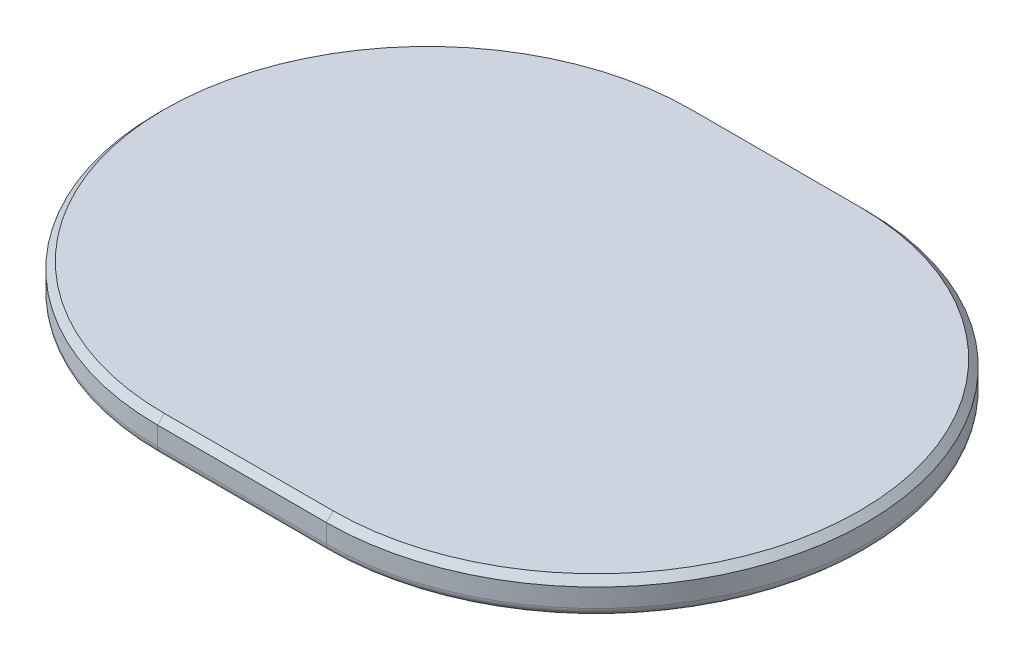
ISO-10303-21;
HEADER;
FILE_DESCRIPTION(('STEP AP214'),'2;1');
FILE_NAME('part.step','',(''),(''),'','','');
FILE_SCHEMA(('AUTOMOTIVE_DESIGN { 1 0 10303 214 1 1 1 1 }'));
ENDSEC;
DATA;
#1=APPLICATION_CONTEXT('core data for automotive mechanical design processes');
#2=APPLICATION_PROTOCOL_DEFINITION('international standard','automotive_design',2000,#1);
#3=PRODUCT_CONTEXT('',#1,'mechanical');
#4=PRODUCT('Part','Part','',(#3));
#5=PRODUCT_RELATED_PRODUCT_CATEGORY('part','',(#4));
#6=PRODUCT_DEFINITION_FORMATION('','',#4);
#7=PRODUCT_DEFINITION_CONTEXT('part definition',#1,'design');
#8=PRODUCT_DEFINITION('design','',#6,#7);
#9=PRODUCT_DEFINITION_SHAPE('','',#8);
#10=(LENGTH_UNIT() NAMED_UNIT(*) SI_UNIT(.MILLI.,.METRE.));
#11=(NAMED_UNIT(*) PLANE_ANGLE_UNIT() SI_UNIT($,.RADIAN.));
#12=(NAMED_UNIT(*) SI_UNIT($,.STERADIAN.) SOLID_ANGLE_UNIT());
#13=UNCERTAINTY_MEASURE_WITH_UNIT(LENGTH_MEASURE(1.E-05),#10,'distance_accuracy_value','');
#14=(GEOMETRIC_REPRESENTATION_CONTEXT(3) GLOBAL_UNCERTAINTY_ASSIGNED_CONTEXT((#13)) GLOBAL_UNIT_ASSIGNED_CONTEXT((#10,
#11,#12)) REPRESENTATION_CONTEXT('',''));
#15=CARTESIAN_POINT('',(0.,0.,0.));
#16=DIRECTION('',(0.,0.,1.));
#17=DIRECTION('',(1.,0.,0.));
#18=AXIS2_PLACEMENT_3D('',#15,#16,#17);
#19=CARTESIAN_POINT('',(-10.,4.,0.));
#20=DIRECTION('',(0.,-1.,0.));
#21=DIRECTION('',(0.,0.,-1.));
#22=AXIS2_PLACEMENT_3D('',#19,#20,#21);
#23=CYLINDRICAL_SURFACE('',#22,32.);
#24=DIRECTION('',(0.,-1.,0.));
#25=VECTOR('',#24,1.);
#26=CARTESIAN_POINT('',(-10.,4.,-32.));
#27=LINE('',#26,#25);
#28=CARTESIAN_POINT('',(-10.,3.20000000000002,-32.));
#29=VERTEX_POINT('',#28);
#30=CARTESIAN_POINT('',(-10.,1.,-32.));
#31=VERTEX_POINT('',#30);
#32=EDGE_CURVE('E155',#29,#31,#27,.T.);
#33=ORIENTED_EDGE('',*,*,#32,.T.);
#34=CARTESIAN_POINT('',(-10.,1.,0.));
#35=DIRECTION('',(0.,1.,0.));
#36=DIRECTION('',(0.,0.,1.));
#37=AXIS2_PLACEMENT_3D('',#34,#35,#36);
#38=CIRCLE('',#37,32.);
#39=CARTESIAN_POINT('',(-10.,1.,32.));
#40=VERTEX_POINT('',#39);
#41=EDGE_CURVE('E11',#31,#40,#38,.T.);
#42=ORIENTED_EDGE('',*,*,#41,.T.);
#43=DIRECTION('',(0.,-1.,0.));
#44=VECTOR('',#43,1.);
#45=CARTESIAN_POINT('',(-10.,4.,32.));
#46=LINE('',#45,#44);
#47=CARTESIAN_POINT('',(-10.,3.20000000000002,32.));
#48=VERTEX_POINT('',#47);
#49=EDGE_CURVE('E129',#48,#40,#46,.T.);
#50=ORIENTED_EDGE('',*,*,#49,.F.);
#51=CARTESIAN_POINT('',(-10.,3.20000000000002,0.));
#52=DIRECTION('',(0.,1.,0.));
#53=DIRECTION('',(0.,0.,1.));
#54=AXIS2_PLACEMENT_3D('',#51,#52,#53);
#55=CIRCLE('',#54,32.);
#56=EDGE_CURVE('E145',#48,#29,#55,.F.);
#57=ORIENTED_EDGE('',*,*,#56,.T.);
#58=EDGE_LOOP('',(#33,#42,#50,#57));
#59=FACE_BOUND('',#58,.T.);
#60=ADVANCED_FACE('F41',(#59),#23,.T.);
#61=CARTESIAN_POINT('',(-10.,4.,32.));
#62=DIRECTION('',(0.,0.,-1.));
#63=DIRECTION('',(-1.,0.,0.));
#64=AXIS2_PLACEMENT_3D('',#61,#62,#63);
#65=PLANE('',#64);
#66=ORIENTED_EDGE('',*,*,#49,.T.);
#67=DIRECTION('',(1.,0.,0.));
#68=VECTOR('',#67,1.);
#69=CARTESIAN_POINT('',(-10.,1.,32.));
#70=LINE('',#69,#68);
#71=CARTESIAN_POINT('',(10.,1.,32.));
#72=VERTEX_POINT('',#71);
#73=EDGE_CURVE('E144',#40,#72,#70,.T.);
#74=ORIENTED_EDGE('',*,*,#73,.T.);
#75=DIRECTION('',(0.,-1.,0.));
#76=VECTOR('',#75,1.);
#77=CARTESIAN_POINT('',(10.,4.,32.));
#78=LINE('',#77,#76);
#79=CARTESIAN_POINT('',(10.,3.20000000000002,32.));
#80=VERTEX_POINT('',#79);
#81=EDGE_CURVE('E192',#80,#72,#78,.T.);
#82=ORIENTED_EDGE('',*,*,#81,.F.);
#83=DIRECTION('',(-1.,0.,0.));
#84=VECTOR('',#83,1.);
#85=CARTESIAN_POINT('',(-10.,3.20000000000002,32.));
#86=LINE('',#85,#84);
#87=EDGE_CURVE('E142',#80,#48,#86,.T.);
#88=ORIENTED_EDGE('',*,*,#87,.T.);
#89=EDGE_LOOP('',(#66,#74,#82,#88));
#90=FACE_BOUND('',#89,.T.);
#91=ADVANCED_FACE('F193',(#90),#65,.F.);
#92=CARTESIAN_POINT('',(10.,4.,0.));
#93=DIRECTION('',(0.,-1.,0.));
#94=DIRECTION('',(0.,0.,-1.));
#95=AXIS2_PLACEMENT_3D('',#92,#93,#94);
#96=CYLINDRICAL_SURFACE('',#95,32.);
#97=ORIENTED_EDGE('',*,*,#81,.T.);
#98=CARTESIAN_POINT('',(10.,1.,0.));
#99=DIRECTION('',(0.,1.,0.));
#100=DIRECTION('',(0.,0.,1.));
#101=AXIS2_PLACEMENT_3D('',#98,#99,#100);
#102=CIRCLE('',#101,32.);
#103=CARTESIAN_POINT('',(9.99999999999999,1.,-32.));
#104=VERTEX_POINT('',#103);
#105=EDGE_CURVE('E65',#72,#104,#102,.T.);
#106=ORIENTED_EDGE('',*,*,#105,.T.);
#107=DIRECTION('',(0.,-1.,0.));
#108=VECTOR('',#107,1.);
#109=CARTESIAN_POINT('',(9.99999999999999,4.,-32.));
#110=LINE('',#109,#108);
#111=CARTESIAN_POINT('',(9.99999999999999,3.20000000000002,-32.));
#112=VERTEX_POINT('',#111);
#113=EDGE_CURVE('E199',#112,#104,#110,.T.);
#114=ORIENTED_EDGE('',*,*,#113,.F.);
#115=CARTESIAN_POINT('',(10.,3.20000000000002,0.));
#116=DIRECTION('',(0.,1.,0.));
#117=DIRECTION('',(0.,0.,1.));
#118=AXIS2_PLACEMENT_3D('',#115,#116,#117);
#119=CIRCLE('',#118,32.);
#120=EDGE_CURVE('E139',#112,#80,#119,.F.);
#121=ORIENTED_EDGE('',*,*,#120,.T.);
#122=EDGE_LOOP('',(#97,#106,#114,#121));
#123=FACE_BOUND('',#122,.T.);
#124=ADVANCED_FACE('F196',(#123),#96,.T.);
#125=CARTESIAN_POINT('',(-10.,4.,-32.));
#126=DIRECTION('',(0.,0.,1.));
#127=DIRECTION('',(1.,0.,0.));
#128=AXIS2_PLACEMENT_3D('',#125,#126,#127);
#129=PLANE('',#128);
#130=ORIENTED_EDGE('',*,*,#113,.T.);
#131=DIRECTION('',(-1.,0.,0.));
#132=VECTOR('',#131,1.);
#133=CARTESIAN_POINT('',(-10.,1.,-32.));
#134=LINE('',#133,#132);
#135=EDGE_CURVE('E49',#104,#31,#134,.T.);
#136=ORIENTED_EDGE('',*,*,#135,.T.);
#137=ORIENTED_EDGE('',*,*,#32,.F.);
#138=DIRECTION('',(1.,0.,0.));
#139=VECTOR('',#138,1.);
#140=CARTESIAN_POINT('',(9.99999999999999,3.20000000000002,-32.));
#141=LINE('',#140,#139);
#142=EDGE_CURVE('E116',#29,#112,#141,.T.);
#143=ORIENTED_EDGE('',*,*,#142,.T.);
#144=EDGE_LOOP('',(#130,#136,#137,#143));
#145=FACE_BOUND('',#144,.T.);
#146=ADVANCED_FACE('F209',(#145),#129,.F.);
#147=CARTESIAN_POINT('',(-10.,4.,0.));
#148=DIRECTION('',(0.,1.,0.));
#149=DIRECTION('',(0.,0.,1.));
#150=AXIS2_PLACEMENT_3D('',#147,#148,#149);
#151=PLANE('',#150);
#152=CARTESIAN_POINT('',(10.,4.,0.));
#153=DIRECTION('',(0.,1.,0.));
#154=DIRECTION('',(0.,0.,1.));
#155=AXIS2_PLACEMENT_3D('',#152,#153,#154);
#156=CIRCLE('',#155,31.2);
#157=CARTESIAN_POINT('',(10.,4.,31.2));
#158=VERTEX_POINT('',#157);
#159=CARTESIAN_POINT('',(9.99999999999999,4.,-31.2));
#160=VERTEX_POINT('',#159);
#161=EDGE_CURVE('E134',#158,#160,#156,.T.);
#162=ORIENTED_EDGE('',*,*,#161,.T.);
#163=DIRECTION('',(-1.,0.,0.));
#164=VECTOR('',#163,1.);
#165=CARTESIAN_POINT('',(-10.,4.,-31.2));
#166=LINE('',#165,#164);
#167=CARTESIAN_POINT('',(-10.,4.,-31.2));
#168=VERTEX_POINT('',#167);
#169=EDGE_CURVE('E111',#160,#168,#166,.T.);
#170=ORIENTED_EDGE('',*,*,#169,.T.);
#171=CARTESIAN_POINT('',(-10.,4.,0.));
#172=DIRECTION('',(0.,1.,0.));
#173=DIRECTION('',(0.,0.,1.));
#174=AXIS2_PLACEMENT_3D('',#171,#172,#173);
#175=CIRCLE('',#174,31.2);
#176=CARTESIAN_POINT('',(-10.,4.,31.2));
#177=VERTEX_POINT('',#176);
#178=EDGE_CURVE('E121',#168,#177,#175,.T.);
#179=ORIENTED_EDGE('',*,*,#178,.T.);
#180=DIRECTION('',(1.,0.,0.));
#181=VECTOR('',#180,1.);
#182=CARTESIAN_POINT('',(10.,4.,31.2));
#183=LINE('',#182,#181);
#184=EDGE_CURVE('E126',#177,#158,#183,.T.);
#185=ORIENTED_EDGE('',*,*,#184,.T.);
#186=EDGE_LOOP('',(#162,#170,#179,#185));
#187=FACE_BOUND('',#186,.T.);
#188=ADVANCED_FACE('F131',(#187),#151,.T.);
#189=CARTESIAN_POINT('',(-10.,0.,0.));
#190=DIRECTION('',(0.,1.,0.));
#191=DIRECTION('',(0.,0.,1.));
#192=AXIS2_PLACEMENT_3D('',#189,#190,#191);
#193=PLANE('',#192);
#194=CARTESIAN_POINT('',(10.,0.,0.));
#195=DIRECTION('',(0.,1.,0.));
#196=DIRECTION('',(0.,0.,1.));
#197=AXIS2_PLACEMENT_3D('',#194,#195,#196);
#198=CIRCLE('',#197,31.);
#199=CARTESIAN_POINT('',(9.99999999999999,0.,-31.));
#200=VERTEX_POINT('',#199);
#201=CARTESIAN_POINT('',(10.,0.,31.));
#202=VERTEX_POINT('',#201);
#203=EDGE_CURVE('E157',#200,#202,#198,.F.);
#204=ORIENTED_EDGE('',*,*,#203,.T.);
#205=DIRECTION('',(1.,0.,0.));
#206=VECTOR('',#205,1.);
#207=CARTESIAN_POINT('',(-9.99999999999999,0.,31.));
#208=LINE('',#207,#206);
#209=CARTESIAN_POINT('',(-10.,0.,31.));
#210=VERTEX_POINT('',#209);
#211=EDGE_CURVE('E161',#202,#210,#208,.F.);
#212=ORIENTED_EDGE('',*,*,#211,.T.);
#213=CARTESIAN_POINT('',(-10.,0.,0.));
#214=DIRECTION('',(0.,1.,0.));
#215=DIRECTION('',(0.,0.,1.));
#216=AXIS2_PLACEMENT_3D('',#213,#214,#215);
#217=CIRCLE('',#216,31.);
#218=CARTESIAN_POINT('',(-10.,0.,-31.));
#219=VERTEX_POINT('',#218);
#220=EDGE_CURVE('E154',#210,#219,#217,.F.);
#221=ORIENTED_EDGE('',*,*,#220,.T.);
#222=DIRECTION('',(-1.,0.,0.));
#223=VECTOR('',#222,1.);
#224=CARTESIAN_POINT('',(-10.,0.,-31.));
#225=LINE('',#224,#223);
#226=EDGE_CURVE('E160',#219,#200,#225,.F.);
#227=ORIENTED_EDGE('',*,*,#226,.T.);
#228=EDGE_LOOP('',(#204,#212,#221,#227));
#229=FACE_BOUND('',#228,.T.);
#230=ADVANCED_FACE('F184',(#229),#193,.F.);
#231=CARTESIAN_POINT('',(-9.99999999999999,4.,31.2));
#232=DIRECTION('',(0.,0.707106781186554,0.707106781186541));
#233=DIRECTION('',(-1.,0.,0.));
#234=AXIS2_PLACEMENT_3D('',#231,#232,#233);
#235=PLANE('',#234);
#236=DIRECTION('',(0.,0.707106781186541,-0.707106781186554));
#237=VECTOR('',#236,1.);
#238=CARTESIAN_POINT('',(-10.,3.20000000000002,32.));
#239=LINE('',#238,#237);
#240=EDGE_CURVE('E122',#48,#177,#239,.T.);
#241=ORIENTED_EDGE('',*,*,#240,.F.);
#242=ORIENTED_EDGE('',*,*,#87,.F.);
#243=DIRECTION('',(0.,-0.707106781186541,0.707106781186554));
#244=VECTOR('',#243,1.);
#245=CARTESIAN_POINT('',(10.,4.,31.2));
#246=LINE('',#245,#244);
#247=EDGE_CURVE('E149',#158,#80,#246,.T.);
#248=ORIENTED_EDGE('',*,*,#247,.F.);
#249=ORIENTED_EDGE('',*,*,#184,.F.);
#250=EDGE_LOOP('',(#241,#242,#248,#249));
#251=FACE_BOUND('',#250,.T.);
#252=ADVANCED_FACE('F210',(#251),#235,.T.);
#253=CARTESIAN_POINT('',(10.,4.,0.));
#254=DIRECTION('',(0.,-1.,0.));
#255=DIRECTION('',(0.,0.,-1.));
#256=AXIS2_PLACEMENT_3D('',#253,#254,#255);
#257=CONICAL_SURFACE('',#256,31.2,0.785398163397457);
#258=ORIENTED_EDGE('',*,*,#247,.T.);
#259=ORIENTED_EDGE('',*,*,#120,.F.);
#260=DIRECTION('',(0.,-0.70710678118654,-0.707106781186555));
#261=VECTOR('',#260,1.);
#262=CARTESIAN_POINT('',(9.99999999999999,4.,-31.2));
#263=LINE('',#262,#261);
#264=EDGE_CURVE('E118',#160,#112,#263,.T.);
#265=ORIENTED_EDGE('',*,*,#264,.F.);
#266=ORIENTED_EDGE('',*,*,#161,.F.);
#267=EDGE_LOOP('',(#258,#259,#265,#266));
#268=FACE_BOUND('',#267,.T.);
#269=ADVANCED_FACE('F207',(#268),#257,.T.);
#270=CARTESIAN_POINT('',(-10.,4.,0.));
#271=DIRECTION('',(0.,-1.,0.));
#272=DIRECTION('',(0.,0.,-1.));
#273=AXIS2_PLACEMENT_3D('',#270,#271,#272);
#274=CONICAL_SURFACE('',#273,31.2,0.785398163397457);
#275=ORIENTED_EDGE('',*,*,#240,.T.);
#276=ORIENTED_EDGE('',*,*,#178,.F.);
#277=DIRECTION('',(0.,0.707106781186541,0.707106781186554));
#278=VECTOR('',#277,1.);
#279=CARTESIAN_POINT('',(-10.,3.20000000000002,-32.));
#280=LINE('',#279,#278);
#281=EDGE_CURVE('E109',#29,#168,#280,.T.);
#282=ORIENTED_EDGE('',*,*,#281,.F.);
#283=ORIENTED_EDGE('',*,*,#56,.F.);
#284=EDGE_LOOP('',(#275,#276,#282,#283));
#285=FACE_BOUND('',#284,.T.);
#286=ADVANCED_FACE('F125',(#285),#274,.T.);
#287=CARTESIAN_POINT('',(-10.,4.,-31.2));
#288=DIRECTION('',(0.,0.707106781186554,-0.707106781186541));
#289=DIRECTION('',(1.,0.,0.));
#290=AXIS2_PLACEMENT_3D('',#287,#288,#289);
#291=PLANE('',#290);
#292=ORIENTED_EDGE('',*,*,#264,.T.);
#293=ORIENTED_EDGE('',*,*,#142,.F.);
#294=ORIENTED_EDGE('',*,*,#281,.T.);
#295=ORIENTED_EDGE('',*,*,#169,.F.);
#296=EDGE_LOOP('',(#292,#293,#294,#295));
#297=FACE_BOUND('',#296,.T.);
#298=ADVANCED_FACE('F115',(#297),#291,.T.);
#299=CARTESIAN_POINT('',(-10.,1.,-31.));
#300=DIRECTION('',(-1.,0.,0.));
#301=DIRECTION('',(0.,0.,1.));
#302=AXIS2_PLACEMENT_3D('',#299,#300,#301);
#303=CYLINDRICAL_SURFACE('',#302,1.);
#304=CARTESIAN_POINT('',(9.99999999999999,1.,-31.));
#305=DIRECTION('',(1.,0.,0.));
#306=DIRECTION('',(0.,0.,-1.));
#307=AXIS2_PLACEMENT_3D('',#304,#305,#306);
#308=CIRCLE('',#307,1.);
#309=EDGE_CURVE('E166',#200,#104,#308,.T.);
#310=ORIENTED_EDGE('',*,*,#309,.F.);
#311=ORIENTED_EDGE('',*,*,#226,.F.);
#312=CARTESIAN_POINT('',(-10.,1.,-31.));
#313=DIRECTION('',(-1.,0.,0.));
#314=DIRECTION('',(0.,0.,1.));
#315=AXIS2_PLACEMENT_3D('',#312,#313,#314);
#316=CIRCLE('',#315,1.);
#317=EDGE_CURVE('E44',#31,#219,#316,.T.);
#318=ORIENTED_EDGE('',*,*,#317,.F.);
#319=ORIENTED_EDGE('',*,*,#135,.F.);
#320=EDGE_LOOP('',(#310,#311,#318,#319));
#321=FACE_BOUND('',#320,.T.);
#322=ADVANCED_FACE('F43',(#321),#303,.T.);
#323=CARTESIAN_POINT('',(-10.,1.,0.));
#324=DIRECTION('',(0.,1.,0.));
#325=DIRECTION('',(0.,0.,1.));
#326=AXIS2_PLACEMENT_3D('',#323,#324,#325);
#327=TOROIDAL_SURFACE('',#326,31.,1.);
#328=ORIENTED_EDGE('',*,*,#317,.T.);
#329=ORIENTED_EDGE('',*,*,#220,.F.);
#330=CARTESIAN_POINT('',(-10.,1.,31.));
#331=DIRECTION('',(1.,0.,0.));
#332=DIRECTION('',(0.,0.,-1.));
#333=AXIS2_PLACEMENT_3D('',#330,#331,#332);
#334=CIRCLE('',#333,1.);
#335=EDGE_CURVE('E169',#40,#210,#334,.T.);
#336=ORIENTED_EDGE('',*,*,#335,.F.);
#337=ORIENTED_EDGE('',*,*,#41,.F.);
#338=EDGE_LOOP('',(#328,#329,#336,#337));
#339=FACE_BOUND('',#338,.T.);
#340=ADVANCED_FACE('F178',(#339),#327,.T.);
#341=CARTESIAN_POINT('',(10.,1.,0.));
#342=DIRECTION('',(0.,1.,0.));
#343=DIRECTION('',(0.,0.,1.));
#344=AXIS2_PLACEMENT_3D('',#341,#342,#343);
#345=TOROIDAL_SURFACE('',#344,31.,1.);
#346=ORIENTED_EDGE('',*,*,#309,.T.);
#347=ORIENTED_EDGE('',*,*,#105,.F.);
#348=CARTESIAN_POINT('',(10.,1.,31.));
#349=DIRECTION('',(-1.,0.,0.));
#350=DIRECTION('',(0.,0.,1.));
#351=AXIS2_PLACEMENT_3D('',#348,#349,#350);
#352=CIRCLE('',#351,1.);
#353=EDGE_CURVE('E167',#202,#72,#352,.T.);
#354=ORIENTED_EDGE('',*,*,#353,.F.);
#355=ORIENTED_EDGE('',*,*,#203,.F.);
#356=EDGE_LOOP('',(#346,#347,#354,#355));
#357=FACE_BOUND('',#356,.T.);
#358=ADVANCED_FACE('F190',(#357),#345,.T.);
#359=CARTESIAN_POINT('',(-10.,1.,31.));
#360=DIRECTION('',(1.,0.,0.));
#361=DIRECTION('',(0.,0.,-1.));
#362=AXIS2_PLACEMENT_3D('',#359,#360,#361);
#363=CYLINDRICAL_SURFACE('',#362,1.);
#364=ORIENTED_EDGE('',*,*,#335,.T.);
#365=ORIENTED_EDGE('',*,*,#211,.F.);
#366=ORIENTED_EDGE('',*,*,#353,.T.);
#367=ORIENTED_EDGE('',*,*,#73,.F.);
#368=EDGE_LOOP('',(#364,#365,#366,#367));
#369=FACE_BOUND('',#368,.T.);
#370=ADVANCED_FACE('F189',(#369),#363,.T.);
#371=CLOSED_SHELL('',(#60,#91,#124,#146,#188,#230,#252,#269,#286,#298,#322,#340,#358,#370));
#372=MANIFOLD_SOLID_BREP('B2',#371);
#373=ADVANCED_BREP_SHAPE_REPRESENTATION('',(#18,#372),#14);
#374=SHAPE_DEFINITION_REPRESENTATION(#9,#373);
ENDSEC;
END-ISO-10303-21;
